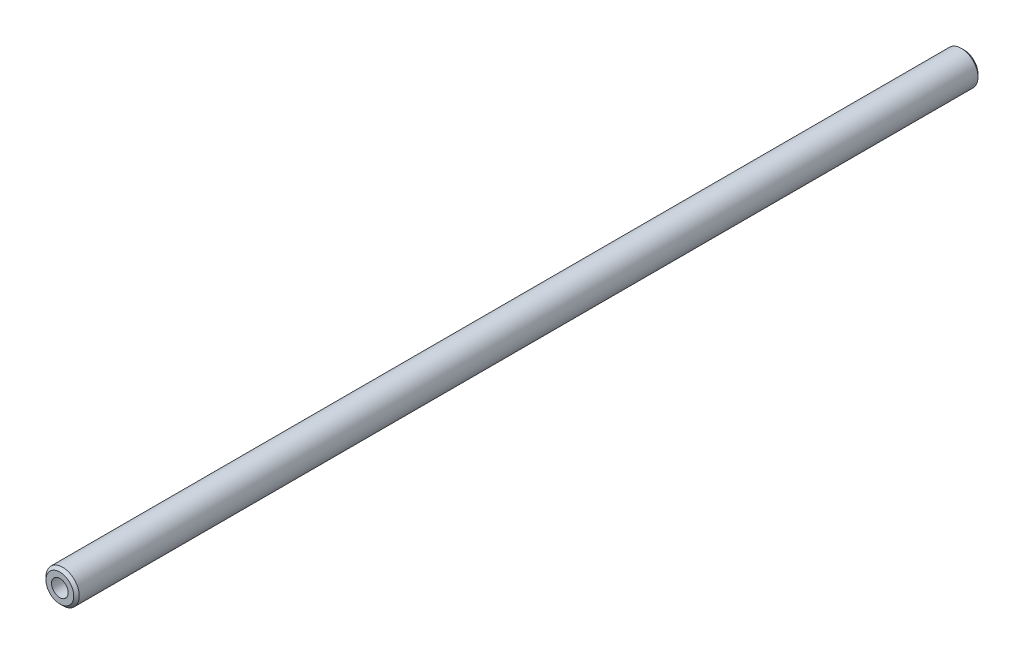
ISO-10303-21;
HEADER;
FILE_DESCRIPTION(('STEP AP214'),'2;1');
FILE_NAME('part.step','',(''),(''),'','','');
FILE_SCHEMA(('AUTOMOTIVE_DESIGN { 1 0 10303 214 1 1 1 1 }'));
ENDSEC;
DATA;
#1=APPLICATION_CONTEXT('core data for automotive mechanical design processes');
#2=APPLICATION_PROTOCOL_DEFINITION('international standard','automotive_design',2000,#1);
#3=PRODUCT_CONTEXT('',#1,'mechanical');
#4=PRODUCT('Part','Part','',(#3));
#5=PRODUCT_RELATED_PRODUCT_CATEGORY('part','',(#4));
#6=PRODUCT_DEFINITION_FORMATION('','',#4);
#7=PRODUCT_DEFINITION_CONTEXT('part definition',#1,'design');
#8=PRODUCT_DEFINITION('design','',#6,#7);
#9=PRODUCT_DEFINITION_SHAPE('','',#8);
#10=(LENGTH_UNIT() NAMED_UNIT(*) SI_UNIT(.MILLI.,.METRE.));
#11=(NAMED_UNIT(*) PLANE_ANGLE_UNIT() SI_UNIT($,.RADIAN.));
#12=(NAMED_UNIT(*) SI_UNIT($,.STERADIAN.) SOLID_ANGLE_UNIT());
#13=UNCERTAINTY_MEASURE_WITH_UNIT(LENGTH_MEASURE(1.E-05),#10,'distance_accuracy_value','');
#14=(GEOMETRIC_REPRESENTATION_CONTEXT(3) GLOBAL_UNCERTAINTY_ASSIGNED_CONTEXT((#13)) GLOBAL_UNIT_ASSIGNED_CONTEXT((#10,
#11,#12)) REPRESENTATION_CONTEXT('',''));
#15=CARTESIAN_POINT('',(0.,0.,0.));
#16=DIRECTION('',(0.,0.,1.));
#17=DIRECTION('',(1.,0.,0.));
#18=AXIS2_PLACEMENT_3D('',#15,#16,#17);
#19=CARTESIAN_POINT('',(0.,0.,326.));
#20=DIRECTION('',(0.,0.,1.));
#21=DIRECTION('',(1.,0.,0.));
#22=AXIS2_PLACEMENT_3D('',#19,#20,#21);
#23=PLANE('',#22);
#24=CARTESIAN_POINT('',(0.,0.,326.));
#25=DIRECTION('',(0.,0.,1.));
#26=DIRECTION('',(1.,0.,0.));
#27=AXIS2_PLACEMENT_3D('',#24,#25,#26);
#28=CIRCLE('',#27,5.00000000000003);
#29=CARTESIAN_POINT('',(5.00000000000003,0.,326.));
#30=VERTEX_POINT('',#29);
#31=EDGE_CURVE('E53',#30,#30,#28,.T.);
#32=ORIENTED_EDGE('',*,*,#31,.T.);
#33=EDGE_LOOP('',(#32));
#34=FACE_BOUND('',#33,.T.);
#35=CARTESIAN_POINT('',(0.,0.,326.));
#36=DIRECTION('',(0.,0.,1.));
#37=DIRECTION('',(1.,0.,0.));
#38=AXIS2_PLACEMENT_3D('',#35,#36,#37);
#39=CIRCLE('',#38,3.);
#40=CARTESIAN_POINT('',(3.,0.,326.));
#41=VERTEX_POINT('',#40);
#42=EDGE_CURVE('E58',#41,#41,#39,.T.);
#43=ORIENTED_EDGE('',*,*,#42,.F.);
#44=EDGE_LOOP('',(#43));
#45=FACE_BOUND('',#44,.T.);
#46=ADVANCED_FACE('F37',(#34,#45),#23,.T.);
#47=CARTESIAN_POINT('',(0.,0.,0.));
#48=DIRECTION('',(0.,0.,1.));
#49=DIRECTION('',(1.,0.,0.));
#50=AXIS2_PLACEMENT_3D('',#47,#48,#49);
#51=PLANE('',#50);
#52=CARTESIAN_POINT('',(0.,0.,0.));
#53=DIRECTION('',(0.,0.,1.));
#54=DIRECTION('',(1.,0.,0.));
#55=AXIS2_PLACEMENT_3D('',#52,#53,#54);
#56=CIRCLE('',#55,4.99999999999989);
#57=CARTESIAN_POINT('',(4.99999999999989,0.,0.));
#58=VERTEX_POINT('',#57);
#59=EDGE_CURVE('E10',#58,#58,#56,.F.);
#60=ORIENTED_EDGE('',*,*,#59,.T.);
#61=EDGE_LOOP('',(#60));
#62=FACE_BOUND('',#61,.T.);
#63=CARTESIAN_POINT('',(0.,0.,0.));
#64=DIRECTION('',(0.,0.,1.));
#65=DIRECTION('',(1.,0.,0.));
#66=AXIS2_PLACEMENT_3D('',#63,#64,#65);
#67=CIRCLE('',#66,3.);
#68=CARTESIAN_POINT('',(3.,0.,0.));
#69=VERTEX_POINT('',#68);
#70=EDGE_CURVE('E59',#69,#69,#67,.T.);
#71=ORIENTED_EDGE('',*,*,#70,.T.);
#72=EDGE_LOOP('',(#71));
#73=FACE_BOUND('',#72,.T.);
#74=ADVANCED_FACE('F69',(#62,#73),#51,.F.);
#75=CARTESIAN_POINT('',(0.,0.,326.));
#76=DIRECTION('',(0.,0.,-1.));
#77=DIRECTION('',(-1.,0.,0.));
#78=AXIS2_PLACEMENT_3D('',#75,#76,#77);
#79=CYLINDRICAL_SURFACE('',#78,6.);
#80=CARTESIAN_POINT('',(0.,0.,325.));
#81=DIRECTION('',(0.,0.,1.));
#82=DIRECTION('',(1.,0.,0.));
#83=AXIS2_PLACEMENT_3D('',#80,#81,#82);
#84=CIRCLE('',#83,6.);
#85=CARTESIAN_POINT('',(6.,0.,325.));
#86=VERTEX_POINT('',#85);
#87=EDGE_CURVE('E45',#86,#86,#84,.F.);
#88=ORIENTED_EDGE('',*,*,#87,.T.);
#89=EDGE_LOOP('',(#88));
#90=FACE_BOUND('',#89,.T.);
#91=CARTESIAN_POINT('',(0.,0.,1.00000000000011));
#92=DIRECTION('',(0.,0.,1.));
#93=DIRECTION('',(1.,0.,0.));
#94=AXIS2_PLACEMENT_3D('',#91,#92,#93);
#95=CIRCLE('',#94,6.);
#96=CARTESIAN_POINT('',(6.,0.,1.00000000000011));
#97=VERTEX_POINT('',#96);
#98=EDGE_CURVE('E49',#97,#97,#95,.T.);
#99=ORIENTED_EDGE('',*,*,#98,.T.);
#100=EDGE_LOOP('',(#99));
#101=FACE_BOUND('',#100,.T.);
#102=ADVANCED_FACE('F75',(#90,#101),#79,.T.);
#103=CARTESIAN_POINT('',(0.,0.,326.));
#104=DIRECTION('',(0.,0.,-1.));
#105=DIRECTION('',(-1.,0.,0.));
#106=AXIS2_PLACEMENT_3D('',#103,#104,#105);
#107=CYLINDRICAL_SURFACE('',#106,3.);
#108=ORIENTED_EDGE('',*,*,#42,.T.);
#109=EDGE_LOOP('',(#108));
#110=FACE_BOUND('',#109,.T.);
#111=ORIENTED_EDGE('',*,*,#70,.F.);
#112=EDGE_LOOP('',(#111));
#113=FACE_BOUND('',#112,.T.);
#114=ADVANCED_FACE('F65',(#110,#113),#107,.F.);
#115=CARTESIAN_POINT('',(0.,0.,326.));
#116=DIRECTION('',(0.,0.,-1.));
#117=DIRECTION('',(-1.,0.,0.));
#118=AXIS2_PLACEMENT_3D('',#115,#116,#117);
#119=CONICAL_SURFACE('',#118,5.00000000000003,0.785398163397432);
#120=ORIENTED_EDGE('',*,*,#87,.F.);
#121=EDGE_LOOP('',(#120));
#122=FACE_BOUND('',#121,.T.);
#123=ORIENTED_EDGE('',*,*,#31,.F.);
#124=EDGE_LOOP('',(#123));
#125=FACE_BOUND('',#124,.T.);
#126=ADVANCED_FACE('F81',(#122,#125),#119,.T.);
#127=CARTESIAN_POINT('',(0.,0.,1.00000000000011));
#128=DIRECTION('',(0.,0.,1.));
#129=DIRECTION('',(1.,0.,0.));
#130=AXIS2_PLACEMENT_3D('',#127,#128,#129);
#131=CONICAL_SURFACE('',#130,6.,0.785398163397446);
#132=ORIENTED_EDGE('',*,*,#59,.F.);
#133=EDGE_LOOP('',(#132));
#134=FACE_BOUND('',#133,.T.);
#135=ORIENTED_EDGE('',*,*,#98,.F.);
#136=EDGE_LOOP('',(#135));
#137=FACE_BOUND('',#136,.T.);
#138=ADVANCED_FACE('F40',(#134,#137),#131,.T.);
#139=CLOSED_SHELL('',(#46,#74,#102,#114,#126,#138));
#140=MANIFOLD_SOLID_BREP('B2',#139);
#141=ADVANCED_BREP_SHAPE_REPRESENTATION('',(#18,#140),#14);
#142=SHAPE_DEFINITION_REPRESENTATION(#9,#141);
ENDSEC;
END-ISO-10303-21;
